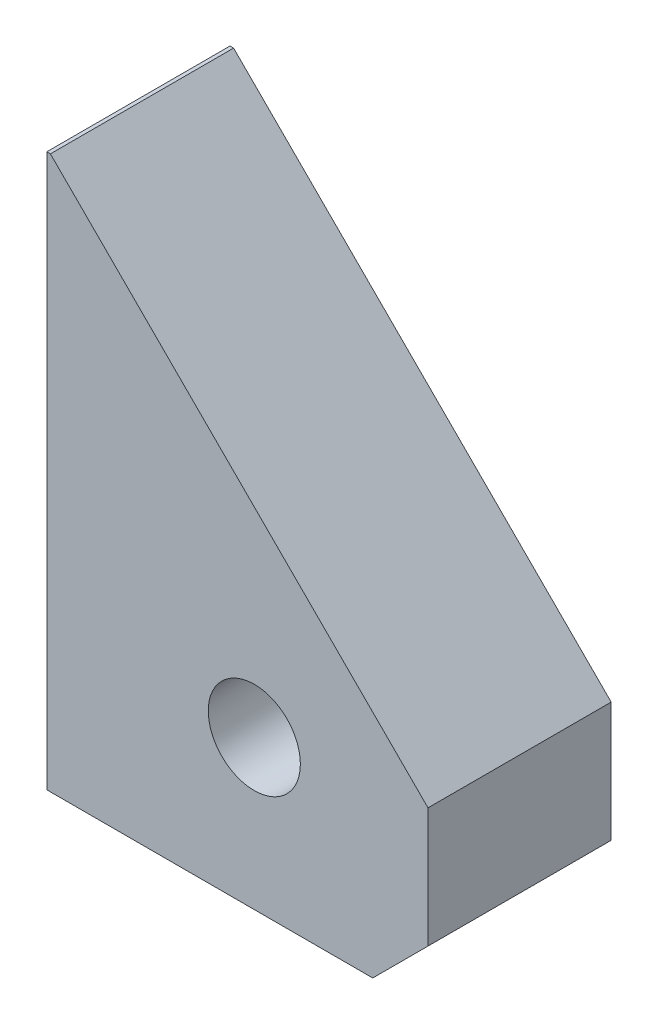
ISO-10303-21;
HEADER;
FILE_DESCRIPTION(('STEP AP214'),'2;1');
FILE_NAME('part.step','',(''),(''),'','','');
FILE_SCHEMA(('AUTOMOTIVE_DESIGN { 1 0 10303 214 1 1 1 1 }'));
ENDSEC;
DATA;
#1=APPLICATION_CONTEXT('core data for automotive mechanical design processes');
#2=APPLICATION_PROTOCOL_DEFINITION('international standard','automotive_design',2000,#1);
#3=PRODUCT_CONTEXT('',#1,'mechanical');
#4=PRODUCT('Part','Part','',(#3));
#5=PRODUCT_RELATED_PRODUCT_CATEGORY('part','',(#4));
#6=PRODUCT_DEFINITION_FORMATION('','',#4);
#7=PRODUCT_DEFINITION_CONTEXT('part definition',#1,'design');
#8=PRODUCT_DEFINITION('design','',#6,#7);
#9=PRODUCT_DEFINITION_SHAPE('','',#8);
#10=(LENGTH_UNIT() NAMED_UNIT(*) SI_UNIT(.MILLI.,.METRE.));
#11=(NAMED_UNIT(*) PLANE_ANGLE_UNIT() SI_UNIT($,.RADIAN.));
#12=(NAMED_UNIT(*) SI_UNIT($,.STERADIAN.) SOLID_ANGLE_UNIT());
#13=UNCERTAINTY_MEASURE_WITH_UNIT(LENGTH_MEASURE(1.E-05),#10,'distance_accuracy_value','');
#14=(GEOMETRIC_REPRESENTATION_CONTEXT(3) GLOBAL_UNCERTAINTY_ASSIGNED_CONTEXT((#13)) GLOBAL_UNIT_ASSIGNED_CONTEXT((#10,
#11,#12)) REPRESENTATION_CONTEXT('',''));
#15=CARTESIAN_POINT('',(0.,0.,0.));
#16=DIRECTION('',(0.,0.,1.));
#17=DIRECTION('',(1.,0.,0.));
#18=AXIS2_PLACEMENT_3D('',#15,#16,#17);
#19=CARTESIAN_POINT('',(27.6805522524221,30.,-17.9231228007651));
#20=DIRECTION('',(-1.,0.,0.));
#21=DIRECTION('',(0.,0.,1.));
#22=AXIS2_PLACEMENT_3D('',#19,#20,#21);
#23=PLANE('',#22);
#24=DIRECTION('',(0.,-1.,0.));
#25=VECTOR('',#24,1.);
#26=CARTESIAN_POINT('',(27.6805522524221,30.,-7.97744734574452));
#27=LINE('',#26,#25);
#28=CARTESIAN_POINT('',(27.6805522524221,9.49999999999993,-7.97744734574452));
#29=VERTEX_POINT('',#28);
#30=CARTESIAN_POINT('',(27.6805522524221,3.,-7.97744734574452));
#31=VERTEX_POINT('',#30);
#32=EDGE_CURVE('E108',#29,#31,#27,.T.);
#33=ORIENTED_EDGE('',*,*,#32,.T.);
#34=DIRECTION('',(0.,0.,-1.));
#35=VECTOR('',#34,1.);
#36=CARTESIAN_POINT('',(27.6805522524221,3.,-17.9231228007651));
#37=LINE('',#36,#35);
#38=CARTESIAN_POINT('',(27.6805522524221,3.,-17.9231228007651));
#39=VERTEX_POINT('',#38);
#40=EDGE_CURVE('E128',#31,#39,#37,.T.);
#41=ORIENTED_EDGE('',*,*,#40,.T.);
#42=DIRECTION('',(0.,-1.,0.));
#43=VECTOR('',#42,1.);
#44=CARTESIAN_POINT('',(27.6805522524221,30.,-17.9231228007651));
#45=LINE('',#44,#43);
#46=CARTESIAN_POINT('',(27.6805522524221,9.49999999999993,-17.9231228007651));
#47=VERTEX_POINT('',#46);
#48=EDGE_CURVE('E100',#47,#39,#45,.T.);
#49=ORIENTED_EDGE('',*,*,#48,.F.);
#50=DIRECTION('',(0.,0.,1.));
#51=VECTOR('',#50,1.);
#52=CARTESIAN_POINT('',(27.6805522524221,9.49999999999993,-17.9231228007651));
#53=LINE('',#52,#51);
#54=EDGE_CURVE('E124',#47,#29,#53,.T.);
#55=ORIENTED_EDGE('',*,*,#54,.T.);
#56=EDGE_LOOP('',(#33,#41,#49,#55));
#57=FACE_BOUND('',#56,.T.);
#58=ADVANCED_FACE('F31',(#57),#23,.F.);
#59=CARTESIAN_POINT('',(27.6805522524221,30.,-17.9231228007651));
#60=DIRECTION('',(0.,0.,1.));
#61=DIRECTION('',(1.,0.,0.));
#62=AXIS2_PLACEMENT_3D('',#59,#60,#61);
#63=PLANE('',#62);
#64=CARTESIAN_POINT('',(18.2505949678204,8.09540117934543,-17.9231228007651));
#65=DIRECTION('',(0.,0.,1.));
#66=DIRECTION('',(1.,0.,0.));
#67=AXIS2_PLACEMENT_3D('',#64,#65,#66);
#68=CIRCLE('',#67,2.49999855507199);
#69=CARTESIAN_POINT('',(20.7505935228924,8.09540117934543,-17.9231228007651));
#70=VERTEX_POINT('',#69);
#71=EDGE_CURVE('E114',#70,#70,#68,.T.);
#72=ORIENTED_EDGE('',*,*,#71,.T.);
#73=EDGE_LOOP('',(#72));
#74=FACE_BOUND('',#73,.T.);
#75=ORIENTED_EDGE('',*,*,#48,.T.);
#76=DIRECTION('',(-0.707106781186548,-0.707106781186547,0.));
#77=VECTOR('',#76,1.);
#78=CARTESIAN_POINT('',(27.6805522524221,3.,-17.9231228007651));
#79=LINE('',#78,#77);
#80=CARTESIAN_POINT('',(24.6805522524221,0.,-17.9231228007651));
#81=VERTEX_POINT('',#80);
#82=EDGE_CURVE('E53',#39,#81,#79,.T.);
#83=ORIENTED_EDGE('',*,*,#82,.T.);
#84=DIRECTION('',(-1.,0.,0.));
#85=VECTOR('',#84,1.);
#86=CARTESIAN_POINT('',(27.6805522524221,0.,-17.9231228007651));
#87=LINE('',#86,#85);
#88=CARTESIAN_POINT('',(6.98559732155321,0.,-17.9231228007651));
#89=VERTEX_POINT('',#88);
#90=EDGE_CURVE('E97',#81,#89,#87,.T.);
#91=ORIENTED_EDGE('',*,*,#90,.T.);
#92=DIRECTION('',(0.,-1.,0.));
#93=VECTOR('',#92,1.);
#94=CARTESIAN_POINT('',(6.98559732155321,30.,-17.9231228007651));
#95=LINE('',#94,#93);
#96=CARTESIAN_POINT('',(6.98559732155321,30.,-17.9231228007651));
#97=VERTEX_POINT('',#96);
#98=EDGE_CURVE('E95',#97,#89,#95,.T.);
#99=ORIENTED_EDGE('',*,*,#98,.F.);
#100=DIRECTION('',(-1.,0.,0.));
#101=VECTOR('',#100,1.);
#102=CARTESIAN_POINT('',(27.6805522524221,30.,-17.9231228007651));
#103=LINE('',#102,#101);
#104=CARTESIAN_POINT('',(7.18055225242208,30.,-17.9231228007651));
#105=VERTEX_POINT('',#104);
#106=EDGE_CURVE('E83',#105,#97,#103,.T.);
#107=ORIENTED_EDGE('',*,*,#106,.F.);
#108=DIRECTION('',(-0.707106781186546,0.707106781186549,0.));
#109=VECTOR('',#108,1.);
#110=CARTESIAN_POINT('',(7.18055225242208,30.,-17.9231228007651));
#111=LINE('',#110,#109);
#112=EDGE_CURVE('E122',#105,#47,#111,.F.);
#113=ORIENTED_EDGE('',*,*,#112,.T.);
#114=EDGE_LOOP('',(#75,#83,#91,#99,#107,#113));
#115=FACE_BOUND('',#114,.T.);
#116=ADVANCED_FACE('F96',(#74,#115),#63,.F.);
#117=CARTESIAN_POINT('',(6.98559732155321,30.,-17.9231228007651));
#118=DIRECTION('',(1.,0.,0.));
#119=DIRECTION('',(0.,0.,-1.));
#120=AXIS2_PLACEMENT_3D('',#117,#118,#119);
#121=PLANE('',#120);
#122=DIRECTION('',(0.,0.,1.));
#123=VECTOR('',#122,1.);
#124=CARTESIAN_POINT('',(6.98559732155321,0.,-17.9231228007651));
#125=LINE('',#124,#123);
#126=CARTESIAN_POINT('',(6.98559732155321,0.,-7.97744734574452));
#127=VERTEX_POINT('',#126);
#128=EDGE_CURVE('E113',#89,#127,#125,.T.);
#129=ORIENTED_EDGE('',*,*,#128,.T.);
#130=DIRECTION('',(0.,-1.,0.));
#131=VECTOR('',#130,1.);
#132=CARTESIAN_POINT('',(6.98559732155321,30.,-7.97744734574452));
#133=LINE('',#132,#131);
#134=CARTESIAN_POINT('',(6.98559732155321,30.,-7.97744734574452));
#135=VERTEX_POINT('',#134);
#136=EDGE_CURVE('E101',#135,#127,#133,.T.);
#137=ORIENTED_EDGE('',*,*,#136,.F.);
#138=DIRECTION('',(0.,0.,1.));
#139=VECTOR('',#138,1.);
#140=CARTESIAN_POINT('',(6.98559732155321,30.,-17.9231228007651));
#141=LINE('',#140,#139);
#142=EDGE_CURVE('E88',#97,#135,#141,.T.);
#143=ORIENTED_EDGE('',*,*,#142,.F.);
#144=ORIENTED_EDGE('',*,*,#98,.T.);
#145=EDGE_LOOP('',(#129,#137,#143,#144));
#146=FACE_BOUND('',#145,.T.);
#147=ADVANCED_FACE('F103',(#146),#121,.F.);
#148=CARTESIAN_POINT('',(27.6805522524221,30.,-7.97744734574452));
#149=DIRECTION('',(0.,0.,-1.));
#150=DIRECTION('',(-1.,0.,0.));
#151=AXIS2_PLACEMENT_3D('',#148,#149,#150);
#152=PLANE('',#151);
#153=CARTESIAN_POINT('',(18.2505949678204,8.09540117934543,-7.97744734574452));
#154=DIRECTION('',(0.,0.,1.));
#155=DIRECTION('',(1.,0.,0.));
#156=AXIS2_PLACEMENT_3D('',#153,#154,#155);
#157=CIRCLE('',#156,2.49999855507199);
#158=CARTESIAN_POINT('',(20.7505935228924,8.09540117934543,-7.97744734574452));
#159=VERTEX_POINT('',#158);
#160=EDGE_CURVE('E220',#159,#159,#157,.T.);
#161=ORIENTED_EDGE('',*,*,#160,.F.);
#162=EDGE_LOOP('',(#161));
#163=FACE_BOUND('',#162,.T.);
#164=DIRECTION('',(1.,0.,0.));
#165=VECTOR('',#164,1.);
#166=CARTESIAN_POINT('',(27.6805522524221,0.,-7.97744734574452));
#167=LINE('',#166,#165);
#168=CARTESIAN_POINT('',(24.6805522524221,0.,-7.97744734574452));
#169=VERTEX_POINT('',#168);
#170=EDGE_CURVE('E92',#127,#169,#167,.T.);
#171=ORIENTED_EDGE('',*,*,#170,.T.);
#172=DIRECTION('',(0.707106781186548,0.707106781186547,0.));
#173=VECTOR('',#172,1.);
#174=CARTESIAN_POINT('',(27.6805522524221,3.,-7.97744734574452));
#175=LINE('',#174,#173);
#176=EDGE_CURVE('E11',#169,#31,#175,.T.);
#177=ORIENTED_EDGE('',*,*,#176,.T.);
#178=ORIENTED_EDGE('',*,*,#32,.F.);
#179=DIRECTION('',(0.707106781186546,-0.707106781186549,0.));
#180=VECTOR('',#179,1.);
#181=CARTESIAN_POINT('',(7.18055225242208,30.,-7.97744734574452));
#182=LINE('',#181,#180);
#183=CARTESIAN_POINT('',(7.18055225242208,30.,-7.97744734574452));
#184=VERTEX_POINT('',#183);
#185=EDGE_CURVE('E126',#29,#184,#182,.F.);
#186=ORIENTED_EDGE('',*,*,#185,.T.);
#187=DIRECTION('',(1.,0.,0.));
#188=VECTOR('',#187,1.);
#189=CARTESIAN_POINT('',(27.6805522524221,30.,-7.97744734574452));
#190=LINE('',#189,#188);
#191=EDGE_CURVE('E106',#135,#184,#190,.T.);
#192=ORIENTED_EDGE('',*,*,#191,.F.);
#193=ORIENTED_EDGE('',*,*,#136,.T.);
#194=EDGE_LOOP('',(#171,#177,#178,#186,#192,#193));
#195=FACE_BOUND('',#194,.T.);
#196=ADVANCED_FACE('F142',(#163,#195),#152,.F.);
#197=CARTESIAN_POINT('',(27.6805522524221,30.,-7.97744734574452));
#198=DIRECTION('',(0.,-1.,0.));
#199=DIRECTION('',(0.,0.,-1.));
#200=AXIS2_PLACEMENT_3D('',#197,#198,#199);
#201=PLANE('',#200);
#202=ORIENTED_EDGE('',*,*,#191,.T.);
#203=DIRECTION('',(0.,0.,-1.));
#204=VECTOR('',#203,1.);
#205=CARTESIAN_POINT('',(7.18055225242208,30.,-7.97744734574452));
#206=LINE('',#205,#204);
#207=EDGE_CURVE('E91',#184,#105,#206,.T.);
#208=ORIENTED_EDGE('',*,*,#207,.T.);
#209=ORIENTED_EDGE('',*,*,#106,.T.);
#210=ORIENTED_EDGE('',*,*,#142,.T.);
#211=EDGE_LOOP('',(#202,#208,#209,#210));
#212=FACE_BOUND('',#211,.T.);
#213=ADVANCED_FACE('F86',(#212),#201,.F.);
#214=CARTESIAN_POINT('',(27.6805522524221,0.,-7.97744734574452));
#215=DIRECTION('',(0.,-1.,0.));
#216=DIRECTION('',(0.,0.,-1.));
#217=AXIS2_PLACEMENT_3D('',#214,#215,#216);
#218=PLANE('',#217);
#219=ORIENTED_EDGE('',*,*,#90,.F.);
#220=DIRECTION('',(0.,0.,1.));
#221=VECTOR('',#220,1.);
#222=CARTESIAN_POINT('',(24.6805522524221,0.,-7.97744734574452));
#223=LINE('',#222,#221);
#224=EDGE_CURVE('E39',#81,#169,#223,.T.);
#225=ORIENTED_EDGE('',*,*,#224,.T.);
#226=ORIENTED_EDGE('',*,*,#170,.F.);
#227=ORIENTED_EDGE('',*,*,#128,.F.);
#228=EDGE_LOOP('',(#219,#225,#226,#227));
#229=FACE_BOUND('',#228,.T.);
#230=ADVANCED_FACE('F151',(#229),#218,.T.);
#231=CARTESIAN_POINT('',(7.18055225242208,30.,-7.97744734574452));
#232=DIRECTION('',(-0.707106781186549,-0.707106781186546,0.));
#233=DIRECTION('',(0.707106781186546,-0.707106781186549,0.));
#234=AXIS2_PLACEMENT_3D('',#231,#232,#233);
#235=PLANE('',#234);
#236=ORIENTED_EDGE('',*,*,#185,.F.);
#237=ORIENTED_EDGE('',*,*,#54,.F.);
#238=ORIENTED_EDGE('',*,*,#112,.F.);
#239=ORIENTED_EDGE('',*,*,#207,.F.);
#240=EDGE_LOOP('',(#236,#237,#238,#239));
#241=FACE_BOUND('',#240,.T.);
#242=ADVANCED_FACE('F140',(#241),#235,.F.);
#243=CARTESIAN_POINT('',(27.6805522524221,3.,-17.9231228007651));
#244=DIRECTION('',(0.707106781186547,-0.707106781186548,0.));
#245=DIRECTION('',(0.707106781186548,0.707106781186547,0.));
#246=AXIS2_PLACEMENT_3D('',#243,#244,#245);
#247=PLANE('',#246);
#248=ORIENTED_EDGE('',*,*,#176,.F.);
#249=ORIENTED_EDGE('',*,*,#224,.F.);
#250=ORIENTED_EDGE('',*,*,#82,.F.);
#251=ORIENTED_EDGE('',*,*,#40,.F.);
#252=EDGE_LOOP('',(#248,#249,#250,#251));
#253=FACE_BOUND('',#252,.T.);
#254=ADVANCED_FACE('F33',(#253),#247,.T.);
#255=CARTESIAN_POINT('',(18.2505949678204,8.09540117934543,-17.9231228007651));
#256=DIRECTION('',(0.,0.,1.));
#257=DIRECTION('',(1.,0.,0.));
#258=AXIS2_PLACEMENT_3D('',#255,#256,#257);
#259=CYLINDRICAL_SURFACE('',#258,2.49999855507199);
#260=ORIENTED_EDGE('',*,*,#71,.F.);
#261=EDGE_LOOP('',(#260));
#262=FACE_BOUND('',#261,.T.);
#263=ORIENTED_EDGE('',*,*,#160,.T.);
#264=EDGE_LOOP('',(#263));
#265=FACE_BOUND('',#264,.T.);
#266=ADVANCED_FACE('F144',(#262,#265),#259,.F.);
#267=CLOSED_SHELL('',(#58,#116,#147,#196,#213,#230,#242,#254,#266));
#268=MANIFOLD_SOLID_BREP('B2',#267);
#269=ADVANCED_BREP_SHAPE_REPRESENTATION('',(#18,#268),#14);
#270=SHAPE_DEFINITION_REPRESENTATION(#9,#269);
ENDSEC;
END-ISO-10303-21;
